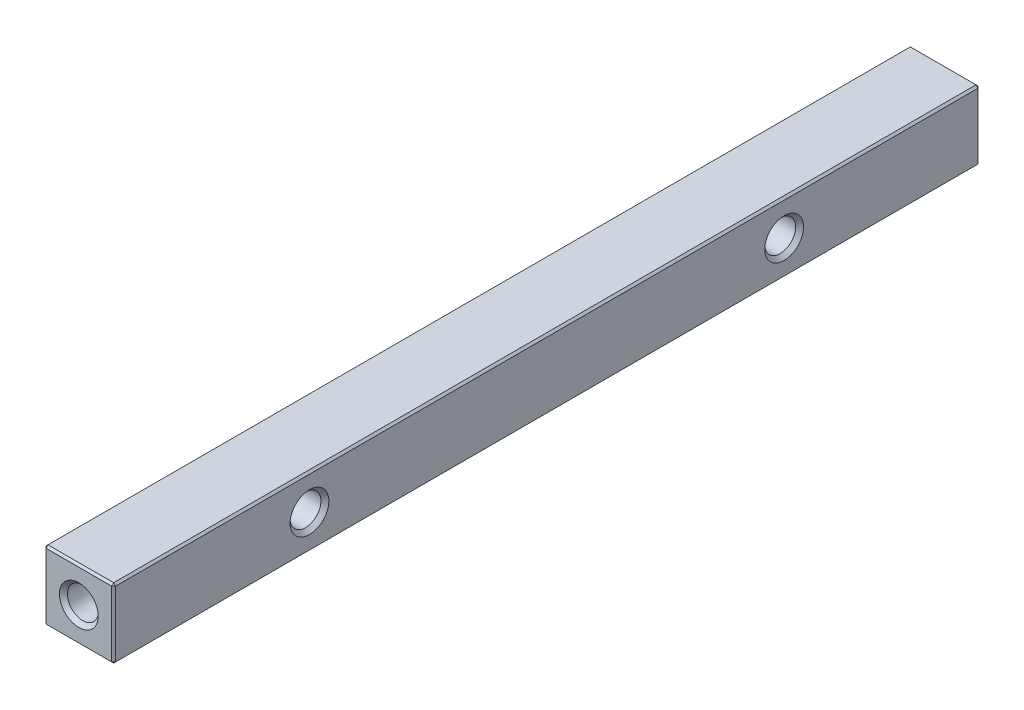
ISO-10303-21;
HEADER;
FILE_DESCRIPTION(('STEP AP214'),'2;1');
FILE_NAME('part.step','',(''),(''),'','','');
FILE_SCHEMA(('AUTOMOTIVE_DESIGN { 1 0 10303 214 1 1 1 1 }'));
ENDSEC;
DATA;
#1=APPLICATION_CONTEXT('core data for automotive mechanical design processes');
#2=APPLICATION_PROTOCOL_DEFINITION('international standard','automotive_design',2000,#1);
#3=PRODUCT_CONTEXT('',#1,'mechanical');
#4=PRODUCT('Part','Part','',(#3));
#5=PRODUCT_RELATED_PRODUCT_CATEGORY('part','',(#4));
#6=PRODUCT_DEFINITION_FORMATION('','',#4);
#7=PRODUCT_DEFINITION_CONTEXT('part definition',#1,'design');
#8=PRODUCT_DEFINITION('design','',#6,#7);
#9=PRODUCT_DEFINITION_SHAPE('','',#8);
#10=(LENGTH_UNIT() NAMED_UNIT(*) SI_UNIT(.MILLI.,.METRE.));
#11=(NAMED_UNIT(*) PLANE_ANGLE_UNIT() SI_UNIT($,.RADIAN.));
#12=(NAMED_UNIT(*) SI_UNIT($,.STERADIAN.) SOLID_ANGLE_UNIT());
#13=UNCERTAINTY_MEASURE_WITH_UNIT(LENGTH_MEASURE(1.E-05),#10,'distance_accuracy_value','');
#14=(GEOMETRIC_REPRESENTATION_CONTEXT(3) GLOBAL_UNCERTAINTY_ASSIGNED_CONTEXT((#13)) GLOBAL_UNIT_ASSIGNED_CONTEXT((#10,
#11,#12)) REPRESENTATION_CONTEXT('',''));
#15=CARTESIAN_POINT('',(0.,0.,0.));
#16=DIRECTION('',(0.,0.,1.));
#17=DIRECTION('',(1.,0.,0.));
#18=AXIS2_PLACEMENT_3D('',#15,#16,#17);
#19=CARTESIAN_POINT('',(4.4,4.39999999999998,54.75));
#20=DIRECTION('',(-1.,0.,0.));
#21=DIRECTION('',(0.,0.,1.));
#22=AXIS2_PLACEMENT_3D('',#19,#20,#21);
#23=PLANE('',#22);
#24=DIRECTION('',(0.,0.,-1.));
#25=VECTOR('',#24,1.);
#26=CARTESIAN_POINT('',(4.4,-4.14999999999998,54.75));
#27=LINE('',#26,#25);
#28=CARTESIAN_POINT('',(4.4,-4.14999999999998,54.5));
#29=VERTEX_POINT('',#28);
#30=CARTESIAN_POINT('',(4.4,-4.14999999999998,-54.5));
#31=VERTEX_POINT('',#30);
#32=EDGE_CURVE('E191',#29,#31,#27,.T.);
#33=ORIENTED_EDGE('',*,*,#32,.T.);
#34=DIRECTION('',(0.,1.,0.));
#35=VECTOR('',#34,1.);
#36=CARTESIAN_POINT('',(4.4,4.39999999999998,-54.5));
#37=LINE('',#36,#35);
#38=CARTESIAN_POINT('',(4.4,4.14999999999998,-54.5));
#39=VERTEX_POINT('',#38);
#40=EDGE_CURVE('E192',#31,#39,#37,.T.);
#41=ORIENTED_EDGE('',*,*,#40,.T.);
#42=DIRECTION('',(0.,0.,1.));
#43=VECTOR('',#42,1.);
#44=CARTESIAN_POINT('',(4.4,4.14999999999998,54.75));
#45=LINE('',#44,#43);
#46=CARTESIAN_POINT('',(4.4,4.14999999999998,54.5));
#47=VERTEX_POINT('',#46);
#48=EDGE_CURVE('E188',#39,#47,#45,.T.);
#49=ORIENTED_EDGE('',*,*,#48,.T.);
#50=DIRECTION('',(0.,-1.,0.));
#51=VECTOR('',#50,1.);
#52=CARTESIAN_POINT('',(4.4,-4.39999999999998,54.5));
#53=LINE('',#52,#51);
#54=EDGE_CURVE('E187',#47,#29,#53,.T.);
#55=ORIENTED_EDGE('',*,*,#54,.T.);
#56=EDGE_LOOP('',(#33,#41,#49,#55));
#57=FACE_BOUND('',#56,.T.);
#58=CARTESIAN_POINT('',(4.4,0.,-30.));
#59=DIRECTION('',(-1.,0.,0.));
#60=DIRECTION('',(0.,0.,1.));
#61=AXIS2_PLACEMENT_3D('',#58,#59,#60);
#62=CIRCLE('',#61,2.45000000000005);
#63=CARTESIAN_POINT('',(4.4,0.,-27.55));
#64=VERTEX_POINT('',#63);
#65=EDGE_CURVE('E291',#64,#64,#62,.T.);
#66=ORIENTED_EDGE('',*,*,#65,.T.);
#67=EDGE_LOOP('',(#66));
#68=FACE_BOUND('',#67,.T.);
#69=CARTESIAN_POINT('',(4.4,0.,30.));
#70=DIRECTION('',(-1.,0.,0.));
#71=DIRECTION('',(0.,0.,1.));
#72=AXIS2_PLACEMENT_3D('',#69,#70,#71);
#73=CIRCLE('',#72,2.45000000000005);
#74=CARTESIAN_POINT('',(4.4,0.,32.45));
#75=VERTEX_POINT('',#74);
#76=EDGE_CURVE('E289',#75,#75,#73,.T.);
#77=ORIENTED_EDGE('',*,*,#76,.T.);
#78=EDGE_LOOP('',(#77));
#79=FACE_BOUND('',#78,.T.);
#80=ADVANCED_FACE('F41',(#57,#68,#79),#23,.F.);
#81=CARTESIAN_POINT('',(-4.4,4.39999999999998,54.75));
#82=DIRECTION('',(0.,-1.,0.));
#83=DIRECTION('',(0.,0.,-1.));
#84=AXIS2_PLACEMENT_3D('',#81,#82,#83);
#85=PLANE('',#84);
#86=DIRECTION('',(1.,0.,0.));
#87=VECTOR('',#86,1.);
#88=CARTESIAN_POINT('',(4.4,4.39999999999998,54.5));
#89=LINE('',#88,#87);
#90=CARTESIAN_POINT('',(-4.15,4.39999999999998,54.5));
#91=VERTEX_POINT('',#90);
#92=CARTESIAN_POINT('',(4.15,4.39999999999998,54.5));
#93=VERTEX_POINT('',#92);
#94=EDGE_CURVE('E202',#91,#93,#89,.T.);
#95=ORIENTED_EDGE('',*,*,#94,.T.);
#96=DIRECTION('',(0.,0.,-1.));
#97=VECTOR('',#96,1.);
#98=CARTESIAN_POINT('',(4.15,4.39999999999998,54.75));
#99=LINE('',#98,#97);
#100=CARTESIAN_POINT('',(4.15,4.39999999999998,-54.5));
#101=VERTEX_POINT('',#100);
#102=EDGE_CURVE('E11',#93,#101,#99,.T.);
#103=ORIENTED_EDGE('',*,*,#102,.T.);
#104=DIRECTION('',(-1.,0.,0.));
#105=VECTOR('',#104,1.);
#106=CARTESIAN_POINT('',(-4.4,4.39999999999998,-54.5));
#107=LINE('',#106,#105);
#108=CARTESIAN_POINT('',(-4.15,4.39999999999998,-54.5));
#109=VERTEX_POINT('',#108);
#110=EDGE_CURVE('E51',#101,#109,#107,.T.);
#111=ORIENTED_EDGE('',*,*,#110,.T.);
#112=DIRECTION('',(0.,0.,1.));
#113=VECTOR('',#112,1.);
#114=CARTESIAN_POINT('',(-4.15,4.39999999999998,54.75));
#115=LINE('',#114,#113);
#116=EDGE_CURVE('E210',#109,#91,#115,.T.);
#117=ORIENTED_EDGE('',*,*,#116,.T.);
#118=EDGE_LOOP('',(#95,#103,#111,#117));
#119=FACE_BOUND('',#118,.T.);
#120=ADVANCED_FACE('F370',(#119),#85,.F.);
#121=CARTESIAN_POINT('',(-4.4,4.39999999999998,54.75));
#122=DIRECTION('',(1.,0.,0.));
#123=DIRECTION('',(0.,0.,-1.));
#124=AXIS2_PLACEMENT_3D('',#121,#122,#123);
#125=PLANE('',#124);
#126=DIRECTION('',(0.,-1.,0.));
#127=VECTOR('',#126,1.);
#128=CARTESIAN_POINT('',(-4.4,4.39999999999998,-54.5));
#129=LINE('',#128,#127);
#130=CARTESIAN_POINT('',(-4.4,4.14999999999998,-54.5));
#131=VERTEX_POINT('',#130);
#132=CARTESIAN_POINT('',(-4.4,-4.14999999999998,-54.5));
#133=VERTEX_POINT('',#132);
#134=EDGE_CURVE('E175',#131,#133,#129,.T.);
#135=ORIENTED_EDGE('',*,*,#134,.T.);
#136=DIRECTION('',(0.,0.,1.));
#137=VECTOR('',#136,1.);
#138=CARTESIAN_POINT('',(-4.4,-4.14999999999998,54.75));
#139=LINE('',#138,#137);
#140=CARTESIAN_POINT('',(-4.4,-4.14999999999998,54.5));
#141=VERTEX_POINT('',#140);
#142=EDGE_CURVE('E138',#133,#141,#139,.T.);
#143=ORIENTED_EDGE('',*,*,#142,.T.);
#144=DIRECTION('',(0.,1.,0.));
#145=VECTOR('',#144,1.);
#146=CARTESIAN_POINT('',(-4.4,4.39999999999998,54.5));
#147=LINE('',#146,#145);
#148=CARTESIAN_POINT('',(-4.4,4.14999999999998,54.5));
#149=VERTEX_POINT('',#148);
#150=EDGE_CURVE('E170',#141,#149,#147,.T.);
#151=ORIENTED_EDGE('',*,*,#150,.T.);
#152=DIRECTION('',(0.,0.,-1.));
#153=VECTOR('',#152,1.);
#154=CARTESIAN_POINT('',(-4.4,4.14999999999998,54.75));
#155=LINE('',#154,#153);
#156=EDGE_CURVE('E166',#149,#131,#155,.T.);
#157=ORIENTED_EDGE('',*,*,#156,.T.);
#158=EDGE_LOOP('',(#135,#143,#151,#157));
#159=FACE_BOUND('',#158,.T.);
#160=CARTESIAN_POINT('',(-4.4,0.,-30.));
#161=DIRECTION('',(1.,0.,0.));
#162=DIRECTION('',(0.,0.,-1.));
#163=AXIS2_PLACEMENT_3D('',#160,#161,#162);
#164=CIRCLE('',#163,2.45000000000005);
#165=CARTESIAN_POINT('',(-4.4,0.,-32.45));
#166=VERTEX_POINT('',#165);
#167=EDGE_CURVE('E290',#166,#166,#164,.T.);
#168=ORIENTED_EDGE('',*,*,#167,.T.);
#169=EDGE_LOOP('',(#168));
#170=FACE_BOUND('',#169,.T.);
#171=CARTESIAN_POINT('',(-4.4,0.,30.));
#172=DIRECTION('',(1.,0.,0.));
#173=DIRECTION('',(0.,0.,-1.));
#174=AXIS2_PLACEMENT_3D('',#171,#172,#173);
#175=CIRCLE('',#174,2.45000000000005);
#176=CARTESIAN_POINT('',(-4.4,0.,27.55));
#177=VERTEX_POINT('',#176);
#178=EDGE_CURVE('E283',#177,#177,#175,.T.);
#179=ORIENTED_EDGE('',*,*,#178,.T.);
#180=EDGE_LOOP('',(#179));
#181=FACE_BOUND('',#180,.T.);
#182=ADVANCED_FACE('F336',(#159,#170,#181),#125,.F.);
#183=CARTESIAN_POINT('',(-4.4,-4.39999999999998,54.75));
#184=DIRECTION('',(0.,1.,0.));
#185=DIRECTION('',(0.,0.,1.));
#186=AXIS2_PLACEMENT_3D('',#183,#184,#185);
#187=PLANE('',#186);
#188=DIRECTION('',(-1.,0.,0.));
#189=VECTOR('',#188,1.);
#190=CARTESIAN_POINT('',(-4.4,-4.39999999999998,54.5));
#191=LINE('',#190,#189);
#192=CARTESIAN_POINT('',(4.15,-4.39999999999998,54.5));
#193=VERTEX_POINT('',#192);
#194=CARTESIAN_POINT('',(-4.15,-4.39999999999998,54.5));
#195=VERTEX_POINT('',#194);
#196=EDGE_CURVE('E164',#193,#195,#191,.T.);
#197=ORIENTED_EDGE('',*,*,#196,.T.);
#198=DIRECTION('',(0.,0.,-1.));
#199=VECTOR('',#198,1.);
#200=CARTESIAN_POINT('',(-4.15,-4.39999999999998,54.75));
#201=LINE('',#200,#199);
#202=CARTESIAN_POINT('',(-4.15,-4.39999999999998,-54.5));
#203=VERTEX_POINT('',#202);
#204=EDGE_CURVE('E136',#195,#203,#201,.T.);
#205=ORIENTED_EDGE('',*,*,#204,.T.);
#206=DIRECTION('',(1.,0.,0.));
#207=VECTOR('',#206,1.);
#208=CARTESIAN_POINT('',(-4.4,-4.39999999999998,-54.5));
#209=LINE('',#208,#207);
#210=CARTESIAN_POINT('',(4.15,-4.39999999999998,-54.5));
#211=VERTEX_POINT('',#210);
#212=EDGE_CURVE('E152',#203,#211,#209,.T.);
#213=ORIENTED_EDGE('',*,*,#212,.T.);
#214=DIRECTION('',(0.,0.,1.));
#215=VECTOR('',#214,1.);
#216=CARTESIAN_POINT('',(4.15,-4.39999999999998,54.75));
#217=LINE('',#216,#215);
#218=EDGE_CURVE('E159',#211,#193,#217,.T.);
#219=ORIENTED_EDGE('',*,*,#218,.T.);
#220=EDGE_LOOP('',(#197,#205,#213,#219));
#221=FACE_BOUND('',#220,.T.);
#222=ADVANCED_FACE('F162',(#221),#187,.F.);
#223=CARTESIAN_POINT('',(0.,0.,54.75));
#224=DIRECTION('',(0.,0.,1.));
#225=DIRECTION('',(1.,0.,0.));
#226=AXIS2_PLACEMENT_3D('',#223,#224,#225);
#227=PLANE('',#226);
#228=DIRECTION('',(0.,-1.,0.));
#229=VECTOR('',#228,1.);
#230=CARTESIAN_POINT('',(-4.15,-4.39999999999998,54.75));
#231=LINE('',#230,#229);
#232=CARTESIAN_POINT('',(-4.15,4.14999999999998,54.75));
#233=VERTEX_POINT('',#232);
#234=CARTESIAN_POINT('',(-4.15,-4.14999999999998,54.75));
#235=VERTEX_POINT('',#234);
#236=EDGE_CURVE('E185',#233,#235,#231,.T.);
#237=ORIENTED_EDGE('',*,*,#236,.T.);
#238=DIRECTION('',(1.,0.,0.));
#239=VECTOR('',#238,1.);
#240=CARTESIAN_POINT('',(4.4,-4.14999999999998,54.75));
#241=LINE('',#240,#239);
#242=CARTESIAN_POINT('',(4.15,-4.14999999999998,54.75));
#243=VERTEX_POINT('',#242);
#244=EDGE_CURVE('E184',#235,#243,#241,.T.);
#245=ORIENTED_EDGE('',*,*,#244,.T.);
#246=DIRECTION('',(0.,1.,0.));
#247=VECTOR('',#246,1.);
#248=CARTESIAN_POINT('',(4.15,4.39999999999998,54.75));
#249=LINE('',#248,#247);
#250=CARTESIAN_POINT('',(4.15,4.14999999999998,54.75));
#251=VERTEX_POINT('',#250);
#252=EDGE_CURVE('E178',#243,#251,#249,.T.);
#253=ORIENTED_EDGE('',*,*,#252,.T.);
#254=DIRECTION('',(-1.,0.,0.));
#255=VECTOR('',#254,1.);
#256=CARTESIAN_POINT('',(-4.4,4.14999999999998,54.75));
#257=LINE('',#256,#255);
#258=EDGE_CURVE('E179',#251,#233,#257,.T.);
#259=ORIENTED_EDGE('',*,*,#258,.T.);
#260=EDGE_LOOP('',(#237,#245,#253,#259));
#261=FACE_BOUND('',#260,.T.);
#262=CARTESIAN_POINT('',(0.,0.,54.75));
#263=DIRECTION('',(0.,0.,1.));
#264=DIRECTION('',(1.,0.,0.));
#265=AXIS2_PLACEMENT_3D('',#262,#263,#264);
#266=CIRCLE('',#265,2.44999999999999);
#267=CARTESIAN_POINT('',(2.44999999999999,0.,54.75));
#268=VERTEX_POINT('',#267);
#269=EDGE_CURVE('E161',#268,#268,#266,.F.);
#270=ORIENTED_EDGE('',*,*,#269,.T.);
#271=EDGE_LOOP('',(#270));
#272=FACE_BOUND('',#271,.T.);
#273=ADVANCED_FACE('F523',(#261,#272),#227,.T.);
#274=CARTESIAN_POINT('',(0.,0.,-54.75));
#275=DIRECTION('',(0.,0.,1.));
#276=DIRECTION('',(1.,0.,0.));
#277=AXIS2_PLACEMENT_3D('',#274,#275,#276);
#278=PLANE('',#277);
#279=DIRECTION('',(0.,-1.,0.));
#280=VECTOR('',#279,1.);
#281=CARTESIAN_POINT('',(4.15,0.,-54.75));
#282=LINE('',#281,#280);
#283=CARTESIAN_POINT('',(4.15,4.14999999999998,-54.75));
#284=VERTEX_POINT('',#283);
#285=CARTESIAN_POINT('',(4.15,-4.14999999999998,-54.75));
#286=VERTEX_POINT('',#285);
#287=EDGE_CURVE('E199',#284,#286,#282,.T.);
#288=ORIENTED_EDGE('',*,*,#287,.T.);
#289=DIRECTION('',(-1.,0.,0.));
#290=VECTOR('',#289,1.);
#291=CARTESIAN_POINT('',(0.,-4.14999999999998,-54.75));
#292=LINE('',#291,#290);
#293=CARTESIAN_POINT('',(-4.15,-4.14999999999998,-54.75));
#294=VERTEX_POINT('',#293);
#295=EDGE_CURVE('E205',#286,#294,#292,.T.);
#296=ORIENTED_EDGE('',*,*,#295,.T.);
#297=DIRECTION('',(0.,1.,0.));
#298=VECTOR('',#297,1.);
#299=CARTESIAN_POINT('',(-4.15,0.,-54.75));
#300=LINE('',#299,#298);
#301=CARTESIAN_POINT('',(-4.15,4.14999999999998,-54.75));
#302=VERTEX_POINT('',#301);
#303=EDGE_CURVE('E198',#294,#302,#300,.T.);
#304=ORIENTED_EDGE('',*,*,#303,.T.);
#305=DIRECTION('',(1.,0.,0.));
#306=VECTOR('',#305,1.);
#307=CARTESIAN_POINT('',(0.,4.14999999999998,-54.75));
#308=LINE('',#307,#306);
#309=EDGE_CURVE('E196',#302,#284,#308,.T.);
#310=ORIENTED_EDGE('',*,*,#309,.T.);
#311=EDGE_LOOP('',(#288,#296,#304,#310));
#312=FACE_BOUND('',#311,.T.);
#313=CARTESIAN_POINT('',(0.,0.,-54.75));
#314=DIRECTION('',(0.,0.,1.));
#315=DIRECTION('',(1.,0.,0.));
#316=AXIS2_PLACEMENT_3D('',#313,#314,#315);
#317=CIRCLE('',#316,2.44999999999999);
#318=CARTESIAN_POINT('',(2.44999999999999,0.,-54.75));
#319=VERTEX_POINT('',#318);
#320=EDGE_CURVE('E305',#319,#319,#317,.T.);
#321=ORIENTED_EDGE('',*,*,#320,.T.);
#322=EDGE_LOOP('',(#321));
#323=FACE_BOUND('',#322,.T.);
#324=ADVANCED_FACE('F344',(#312,#323),#278,.F.);
#325=CARTESIAN_POINT('',(0.,0.,46.75));
#326=DIRECTION('',(0.,0.,1.));
#327=DIRECTION('',(1.,0.,0.));
#328=AXIS2_PLACEMENT_3D('',#325,#326,#327);
#329=CYLINDRICAL_SURFACE('',#328,1.95);
#330=CARTESIAN_POINT('',(0.,0.,54.25));
#331=DIRECTION('',(0.,0.,1.));
#332=DIRECTION('',(1.,0.,0.));
#333=AXIS2_PLACEMENT_3D('',#330,#331,#332);
#334=CIRCLE('',#333,1.95);
#335=CARTESIAN_POINT('',(1.95,0.,54.25));
#336=VERTEX_POINT('',#335);
#337=EDGE_CURVE('E306',#336,#336,#334,.T.);
#338=ORIENTED_EDGE('',*,*,#337,.T.);
#339=EDGE_LOOP('',(#338));
#340=FACE_BOUND('',#339,.T.);
#341=CARTESIAN_POINT('',(0.,0.,46.75));
#342=DIRECTION('',(0.,0.,1.));
#343=DIRECTION('',(1.,0.,0.));
#344=AXIS2_PLACEMENT_3D('',#341,#342,#343);
#345=CIRCLE('',#344,1.95);
#346=CARTESIAN_POINT('',(1.95,0.,46.75));
#347=VERTEX_POINT('',#346);
#348=EDGE_CURVE('E271',#347,#347,#345,.T.);
#349=ORIENTED_EDGE('',*,*,#348,.F.);
#350=EDGE_LOOP('',(#349));
#351=FACE_BOUND('',#350,.T.);
#352=ADVANCED_FACE('F533',(#340,#351),#329,.F.);
#353=CARTESIAN_POINT('',(0.,0.,46.75));
#354=DIRECTION('',(0.,0.,1.));
#355=DIRECTION('',(1.,0.,0.));
#356=AXIS2_PLACEMENT_3D('',#353,#354,#355);
#357=PLANE('',#356);
#358=ORIENTED_EDGE('',*,*,#348,.T.);
#359=EDGE_LOOP('',(#358));
#360=FACE_BOUND('',#359,.T.);
#361=ADVANCED_FACE('F534',(#360),#357,.T.);
#362=CARTESIAN_POINT('',(0.,0.,-46.75));
#363=DIRECTION('',(0.,0.,-1.));
#364=DIRECTION('',(-1.,0.,0.));
#365=AXIS2_PLACEMENT_3D('',#362,#363,#364);
#366=CYLINDRICAL_SURFACE('',#365,1.95);
#367=CARTESIAN_POINT('',(0.,0.,-54.25));
#368=DIRECTION('',(0.,0.,1.));
#369=DIRECTION('',(1.,0.,0.));
#370=AXIS2_PLACEMENT_3D('',#367,#368,#369);
#371=CIRCLE('',#370,1.95);
#372=CARTESIAN_POINT('',(1.95,0.,-54.25));
#373=VERTEX_POINT('',#372);
#374=EDGE_CURVE('E304',#373,#373,#371,.F.);
#375=ORIENTED_EDGE('',*,*,#374,.T.);
#376=EDGE_LOOP('',(#375));
#377=FACE_BOUND('',#376,.T.);
#378=CARTESIAN_POINT('',(0.,0.,-46.75));
#379=DIRECTION('',(0.,0.,1.));
#380=DIRECTION('',(1.,0.,0.));
#381=AXIS2_PLACEMENT_3D('',#378,#379,#380);
#382=CIRCLE('',#381,1.95);
#383=CARTESIAN_POINT('',(1.95,0.,-46.75));
#384=VERTEX_POINT('',#383);
#385=EDGE_CURVE('E264',#384,#384,#382,.T.);
#386=ORIENTED_EDGE('',*,*,#385,.T.);
#387=EDGE_LOOP('',(#386));
#388=FACE_BOUND('',#387,.T.);
#389=ADVANCED_FACE('F537',(#377,#388),#366,.F.);
#390=CARTESIAN_POINT('',(0.,0.,-46.75));
#391=DIRECTION('',(0.,0.,-1.));
#392=DIRECTION('',(1.,0.,0.));
#393=AXIS2_PLACEMENT_3D('',#390,#391,#392);
#394=PLANE('',#393);
#395=ORIENTED_EDGE('',*,*,#385,.F.);
#396=EDGE_LOOP('',(#395));
#397=FACE_BOUND('',#396,.T.);
#398=ADVANCED_FACE('F544',(#397),#394,.T.);
#399=CARTESIAN_POINT('',(-4.401,0.,-30.));
#400=DIRECTION('',(1.,0.,0.));
#401=DIRECTION('',(0.,0.,-1.));
#402=AXIS2_PLACEMENT_3D('',#399,#400,#401);
#403=CYLINDRICAL_SURFACE('',#402,1.95);
#404=CARTESIAN_POINT('',(-3.89999999999996,0.,-30.));
#405=DIRECTION('',(1.,0.,0.));
#406=DIRECTION('',(0.,0.,-1.));
#407=AXIS2_PLACEMENT_3D('',#404,#405,#406);
#408=CIRCLE('',#407,1.95);
#409=CARTESIAN_POINT('',(-3.89999999999996,0.,-31.95));
#410=VERTEX_POINT('',#409);
#411=EDGE_CURVE('E281',#410,#410,#408,.F.);
#412=CARTESIAN_POINT('',(3.89999999999996,0.,-30.));
#413=DIRECTION('',(-1.,0.,0.));
#414=DIRECTION('',(0.,0.,1.));
#415=AXIS2_PLACEMENT_3D('',#412,#413,#414);
#416=CIRCLE('',#415,1.95);
#417=CARTESIAN_POINT('',(3.89999999999996,0.,-31.95));
#418=VERTEX_POINT('',#417);
#419=EDGE_CURVE('E277',#418,#418,#416,.F.);
#420=CARTESIAN_POINT('',(-3.89999999999996,0.,-31.95));
#421=CARTESIAN_POINT('',(-3.81874999999996,0.,-31.95));
#422=CARTESIAN_POINT('',(-3.73749999999996,0.,-31.95));
#423=CARTESIAN_POINT('',(-3.57499999999996,0.,-31.95));
#424=CARTESIAN_POINT('',(-3.49374999999996,0.,-31.95));
#425=CARTESIAN_POINT('',(-3.33124999999996,0.,-31.95));
#426=CARTESIAN_POINT('',(-3.24999999999996,0.,-31.95));
#427=CARTESIAN_POINT('',(-3.08749999999997,0.,-31.95));
#428=CARTESIAN_POINT('',(-3.00624999999997,0.,-31.95));
#429=CARTESIAN_POINT('',(-2.84374999999997,0.,-31.95));
#430=CARTESIAN_POINT('',(-2.76249999999997,0.,-31.95));
#431=CARTESIAN_POINT('',(-2.59999999999997,0.,-31.95));
#432=CARTESIAN_POINT('',(-2.51874999999997,0.,-31.95));
#433=CARTESIAN_POINT('',(-2.35624999999997,0.,-31.95));
#434=CARTESIAN_POINT('',(-2.27499999999998,0.,-31.95));
#435=CARTESIAN_POINT('',(-2.11249999999998,0.,-31.95));
#436=CARTESIAN_POINT('',(-2.03124999999998,0.,-31.95));
#437=CARTESIAN_POINT('',(-1.86874999999998,0.,-31.95));
#438=CARTESIAN_POINT('',(-1.78749999999998,0.,-31.95));
#439=CARTESIAN_POINT('',(-1.62499999999998,0.,-31.95));
#440=CARTESIAN_POINT('',(-1.54374999999998,0.,-31.95));
#441=CARTESIAN_POINT('',(-1.38124999999998,0.,-31.95));
#442=CARTESIAN_POINT('',(-1.29999999999998,0.,-31.95));
#443=CARTESIAN_POINT('',(-1.13749999999999,0.,-31.95));
#444=CARTESIAN_POINT('',(-1.05624999999999,0.,-31.95));
#445=CARTESIAN_POINT('',(-0.893749999999989,0.,-31.95));
#446=CARTESIAN_POINT('',(-0.81249999999999,0.,-31.95));
#447=CARTESIAN_POINT('',(-0.649999999999992,0.,-31.95));
#448=CARTESIAN_POINT('',(-0.568749999999993,0.,-31.95));
#449=CARTESIAN_POINT('',(-0.406249999999995,0.,-31.95));
#450=CARTESIAN_POINT('',(-0.324999999999996,0.,-31.95));
#451=CARTESIAN_POINT('',(-0.162499999999997,0.,-31.95));
#452=CARTESIAN_POINT('',(-0.0812499999999983,0.,-31.95));
#453=CARTESIAN_POINT('',(0.0812500000000003,0.,-31.95));
#454=CARTESIAN_POINT('',(0.1625,0.,-31.95));
#455=CARTESIAN_POINT('',(0.324999999999998,0.,-31.95));
#456=CARTESIAN_POINT('',(0.406249999999998,0.,-31.95));
#457=CARTESIAN_POINT('',(0.568749999999996,0.,-31.95));
#458=CARTESIAN_POINT('',(0.649999999999995,0.,-31.95));
#459=CARTESIAN_POINT('',(0.812499999999993,0.,-31.95));
#460=CARTESIAN_POINT('',(0.893749999999992,0.,-31.95));
#461=CARTESIAN_POINT('',(1.05624999999999,0.,-31.95));
#462=CARTESIAN_POINT('',(1.13749999999999,0.,-31.95));
#463=CARTESIAN_POINT('',(1.29999999999999,0.,-31.95));
#464=CARTESIAN_POINT('',(1.38124999999999,0.,-31.95));
#465=CARTESIAN_POINT('',(1.54374999999999,0.,-31.95));
#466=CARTESIAN_POINT('',(1.62499999999998,0.,-31.95));
#467=CARTESIAN_POINT('',(1.78749999999998,0.,-31.95));
#468=CARTESIAN_POINT('',(1.86874999999998,0.,-31.95));
#469=CARTESIAN_POINT('',(2.03124999999998,0.,-31.95));
#470=CARTESIAN_POINT('',(2.11249999999998,0.,-31.95));
#471=CARTESIAN_POINT('',(2.27499999999998,0.,-31.95));
#472=CARTESIAN_POINT('',(2.35624999999998,0.,-31.95));
#473=CARTESIAN_POINT('',(2.51874999999998,0.,-31.95));
#474=CARTESIAN_POINT('',(2.59999999999997,0.,-31.95));
#475=CARTESIAN_POINT('',(2.76249999999997,0.,-31.95));
#476=CARTESIAN_POINT('',(2.84374999999997,0.,-31.95));
#477=CARTESIAN_POINT('',(3.00624999999997,0.,-31.95));
#478=CARTESIAN_POINT('',(3.08749999999997,0.,-31.95));
#479=CARTESIAN_POINT('',(3.24999999999997,0.,-31.95));
#480=CARTESIAN_POINT('',(3.33124999999997,0.,-31.95));
#481=CARTESIAN_POINT('',(3.49374999999996,0.,-31.95));
#482=CARTESIAN_POINT('',(3.57499999999996,0.,-31.95));
#483=CARTESIAN_POINT('',(3.73749999999996,0.,-31.95));
#484=CARTESIAN_POINT('',(3.81874999999996,0.,-31.95));
#485=CARTESIAN_POINT('',(3.89999999999996,0.,-31.95));
#486=B_SPLINE_CURVE_WITH_KNOTS('',3,(#420,#421,#422,#423,#424,#425,#426,#427,#428,#429,#430,
#431,#432,#433,#434,#435,#436,#437,#438,#439,#440,#441,#442,#443,#444,#445,#446,#447,#448,#449,
#450,#451,#452,#453,#454,#455,#456,#457,#458,#459,#460,#461,#462,#463,#464,#465,#466,#467,#468,
#469,#470,#471,#472,#473,#474,#475,#476,#477,#478,#479,#480,#481,#482,#483,#484,#485),
.UNSPECIFIED.,.F.,.F.,(4,2,2,2,2,2,2,2,2,2,2,2,2,2,2,2,2,2,2,2,2,2,2,2,2,2,2,2,2,2,2,2,4),(0.,
0.243749999999997,0.487499999999995,0.731249999999993,0.97499999999999,1.21874999999999,
1.46249999999998,1.70624999999998,1.94999999999998,2.19374999999998,2.43749999999997,
2.68124999999997,2.92499999999997,3.16874999999997,3.41249999999996,3.65624999999996,
3.89999999999996,4.14374999999996,4.38749999999995,4.63124999999995,4.87499999999995,
5.11874999999995,5.36249999999994,5.60624999999994,5.84999999999994,6.09374999999994,
6.33749999999993,6.58124999999993,6.82499999999993,7.06874999999993,7.31249999999992,
7.55624999999992,7.79999999999992),.UNSPECIFIED.);
#487=EDGE_CURVE('BSEAM745',#410,#418,#486,.T.);
#488=ORIENTED_EDGE('',*,*,#411,.T.);
#489=ORIENTED_EDGE('',*,*,#419,.T.);
#490=ORIENTED_EDGE('',*,*,#487,.T.);
#491=ORIENTED_EDGE('',*,*,#487,.F.);
#492=EDGE_LOOP('',(#488,#490,#489,#491));
#493=FACE_BOUND('',#492,.T.);
#494=ADVANCED_FACE('F745',(#493),#403,.F.);
#495=CARTESIAN_POINT('',(-4.401,0.,30.));
#496=DIRECTION('',(1.,0.,0.));
#497=DIRECTION('',(0.,0.,-1.));
#498=AXIS2_PLACEMENT_3D('',#495,#496,#497);
#499=CYLINDRICAL_SURFACE('',#498,1.95);
#500=CARTESIAN_POINT('',(3.89999999999996,0.,30.));
#501=DIRECTION('',(-1.,0.,0.));
#502=DIRECTION('',(0.,0.,1.));
#503=AXIS2_PLACEMENT_3D('',#500,#501,#502);
#504=CIRCLE('',#503,1.95);
#505=CARTESIAN_POINT('',(3.89999999999996,0.,28.05));
#506=VERTEX_POINT('',#505);
#507=EDGE_CURVE('E298',#506,#506,#504,.F.);
#508=CARTESIAN_POINT('',(-3.89999999999996,0.,30.));
#509=DIRECTION('',(1.,0.,0.));
#510=DIRECTION('',(0.,0.,-1.));
#511=AXIS2_PLACEMENT_3D('',#508,#509,#510);
#512=CIRCLE('',#511,1.95);
#513=CARTESIAN_POINT('',(-3.89999999999996,0.,28.05));
#514=VERTEX_POINT('',#513);
#515=EDGE_CURVE('E296',#514,#514,#512,.F.);
#516=CARTESIAN_POINT('',(3.89999999999996,0.,28.05));
#517=CARTESIAN_POINT('',(3.81874999999996,0.,28.05));
#518=CARTESIAN_POINT('',(3.73749999999996,0.,28.05));
#519=CARTESIAN_POINT('',(3.57499999999996,0.,28.05));
#520=CARTESIAN_POINT('',(3.49374999999996,0.,28.05));
#521=CARTESIAN_POINT('',(3.33124999999997,0.,28.05));
#522=CARTESIAN_POINT('',(3.24999999999997,0.,28.05));
#523=CARTESIAN_POINT('',(3.08749999999997,0.,28.05));
#524=CARTESIAN_POINT('',(3.00624999999997,0.,28.05));
#525=CARTESIAN_POINT('',(2.84374999999997,0.,28.05));
#526=CARTESIAN_POINT('',(2.76249999999997,0.,28.05));
#527=CARTESIAN_POINT('',(2.59999999999997,0.,28.05));
#528=CARTESIAN_POINT('',(2.51874999999998,0.,28.05));
#529=CARTESIAN_POINT('',(2.35624999999998,0.,28.05));
#530=CARTESIAN_POINT('',(2.27499999999998,0.,28.05));
#531=CARTESIAN_POINT('',(2.11249999999998,0.,28.05));
#532=CARTESIAN_POINT('',(2.03124999999998,0.,28.05));
#533=CARTESIAN_POINT('',(1.86874999999998,0.,28.05));
#534=CARTESIAN_POINT('',(1.78749999999998,0.,28.05));
#535=CARTESIAN_POINT('',(1.62499999999998,0.,28.05));
#536=CARTESIAN_POINT('',(1.54374999999999,0.,28.05));
#537=CARTESIAN_POINT('',(1.38124999999999,0.,28.05));
#538=CARTESIAN_POINT('',(1.29999999999999,0.,28.05));
#539=CARTESIAN_POINT('',(1.13749999999999,0.,28.05));
#540=CARTESIAN_POINT('',(1.05624999999999,0.,28.05));
#541=CARTESIAN_POINT('',(0.893749999999992,0.,28.05));
#542=CARTESIAN_POINT('',(0.812499999999993,0.,28.05));
#543=CARTESIAN_POINT('',(0.649999999999995,0.,28.05));
#544=CARTESIAN_POINT('',(0.568749999999996,0.,28.05));
#545=CARTESIAN_POINT('',(0.406249999999998,0.,28.05));
#546=CARTESIAN_POINT('',(0.324999999999998,0.,28.05));
#547=CARTESIAN_POINT('',(0.1625,0.,28.05));
#548=CARTESIAN_POINT('',(0.0812500000000009,0.,28.05));
#549=CARTESIAN_POINT('',(-0.0812499999999977,0.,28.05));
#550=CARTESIAN_POINT('',(-0.162499999999997,0.,28.05));
#551=CARTESIAN_POINT('',(-0.324999999999996,0.,28.05));
#552=CARTESIAN_POINT('',(-0.406249999999995,0.,28.05));
#553=CARTESIAN_POINT('',(-0.568749999999993,0.,28.05));
#554=CARTESIAN_POINT('',(-0.649999999999992,0.,28.05));
#555=CARTESIAN_POINT('',(-0.81249999999999,0.,28.05));
#556=CARTESIAN_POINT('',(-0.893749999999989,0.,28.05));
#557=CARTESIAN_POINT('',(-1.05624999999999,0.,28.05));
#558=CARTESIAN_POINT('',(-1.13749999999999,0.,28.05));
#559=CARTESIAN_POINT('',(-1.29999999999998,0.,28.05));
#560=CARTESIAN_POINT('',(-1.38124999999998,0.,28.05));
#561=CARTESIAN_POINT('',(-1.54374999999998,0.,28.05));
#562=CARTESIAN_POINT('',(-1.62499999999998,0.,28.05));
#563=CARTESIAN_POINT('',(-1.78749999999998,0.,28.05));
#564=CARTESIAN_POINT('',(-1.86874999999998,0.,28.05));
#565=CARTESIAN_POINT('',(-2.03124999999998,0.,28.05));
#566=CARTESIAN_POINT('',(-2.11249999999998,0.,28.05));
#567=CARTESIAN_POINT('',(-2.27499999999998,0.,28.05));
#568=CARTESIAN_POINT('',(-2.35624999999997,0.,28.05));
#569=CARTESIAN_POINT('',(-2.51874999999997,0.,28.05));
#570=CARTESIAN_POINT('',(-2.59999999999997,0.,28.05));
#571=CARTESIAN_POINT('',(-2.76249999999997,0.,28.05));
#572=CARTESIAN_POINT('',(-2.84374999999997,0.,28.05));
#573=CARTESIAN_POINT('',(-3.00624999999997,0.,28.05));
#574=CARTESIAN_POINT('',(-3.08749999999997,0.,28.05));
#575=CARTESIAN_POINT('',(-3.24999999999996,0.,28.05));
#576=CARTESIAN_POINT('',(-3.33124999999996,0.,28.05));
#577=CARTESIAN_POINT('',(-3.49374999999996,0.,28.05));
#578=CARTESIAN_POINT('',(-3.57499999999996,0.,28.05));
#579=CARTESIAN_POINT('',(-3.73749999999996,0.,28.05));
#580=CARTESIAN_POINT('',(-3.81874999999996,0.,28.05));
#581=CARTESIAN_POINT('',(-3.89999999999996,0.,28.05));
#582=B_SPLINE_CURVE_WITH_KNOTS('',3,(#516,#517,#518,#519,#520,#521,#522,#523,#524,#525,#526,
#527,#528,#529,#530,#531,#532,#533,#534,#535,#536,#537,#538,#539,#540,#541,#542,#543,#544,#545,
#546,#547,#548,#549,#550,#551,#552,#553,#554,#555,#556,#557,#558,#559,#560,#561,#562,#563,#564,
#565,#566,#567,#568,#569,#570,#571,#572,#573,#574,#575,#576,#577,#578,#579,#580,#581),
.UNSPECIFIED.,.F.,.F.,(4,2,2,2,2,2,2,2,2,2,2,2,2,2,2,2,2,2,2,2,2,2,2,2,2,2,2,2,2,2,2,2,4),(0.,
0.243749999999997,0.487499999999995,0.731249999999991,0.974999999999989,1.21874999999999,
1.46249999999998,1.70624999999998,1.94999999999998,2.19374999999998,2.43749999999997,
2.68124999999997,2.92499999999997,3.16874999999997,3.41249999999996,3.65624999999996,
3.89999999999996,4.14374999999996,4.38749999999995,4.63124999999995,4.87499999999995,
5.11874999999995,5.36249999999994,5.60624999999994,5.84999999999994,6.09374999999994,
6.33749999999993,6.58124999999993,6.82499999999993,7.06874999999993,7.31249999999992,
7.55624999999992,7.79999999999992),.UNSPECIFIED.);
#583=EDGE_CURVE('BSEAM387',#506,#514,#582,.T.);
#584=ORIENTED_EDGE('',*,*,#507,.T.);
#585=ORIENTED_EDGE('',*,*,#515,.T.);
#586=ORIENTED_EDGE('',*,*,#583,.T.);
#587=ORIENTED_EDGE('',*,*,#583,.F.);
#588=EDGE_LOOP('',(#584,#586,#585,#587));
#589=FACE_BOUND('',#588,.T.);
#590=ADVANCED_FACE('F387',(#589),#499,.F.);
#591=CARTESIAN_POINT('',(-3.89999999999996,0.,-30.));
#592=DIRECTION('',(-1.,0.,0.));
#593=DIRECTION('',(0.,0.,1.));
#594=AXIS2_PLACEMENT_3D('',#591,#592,#593);
#595=CONICAL_SURFACE('',#594,1.95,0.785398163397456);
#596=ORIENTED_EDGE('',*,*,#167,.F.);
#597=EDGE_LOOP('',(#596));
#598=FACE_BOUND('',#597,.T.);
#599=ORIENTED_EDGE('',*,*,#411,.F.);
#600=EDGE_LOOP('',(#599));
#601=FACE_BOUND('',#600,.T.);
#602=ADVANCED_FACE('F377',(#598,#601),#595,.F.);
#603=CARTESIAN_POINT('',(3.89999999999996,0.,-30.));
#604=DIRECTION('',(1.,0.,0.));
#605=DIRECTION('',(0.,0.,-1.));
#606=AXIS2_PLACEMENT_3D('',#603,#604,#605);
#607=CONICAL_SURFACE('',#606,1.95,0.785398163397457);
#608=ORIENTED_EDGE('',*,*,#65,.F.);
#609=EDGE_LOOP('',(#608));
#610=FACE_BOUND('',#609,.T.);
#611=ORIENTED_EDGE('',*,*,#419,.F.);
#612=EDGE_LOOP('',(#611));
#613=FACE_BOUND('',#612,.T.);
#614=ADVANCED_FACE('F384',(#610,#613),#607,.F.);
#615=CARTESIAN_POINT('',(3.89999999999996,0.,30.));
#616=DIRECTION('',(1.,0.,0.));
#617=DIRECTION('',(0.,0.,-1.));
#618=AXIS2_PLACEMENT_3D('',#615,#616,#617);
#619=CONICAL_SURFACE('',#618,1.95,0.785398163397457);
#620=ORIENTED_EDGE('',*,*,#76,.F.);
#621=EDGE_LOOP('',(#620));
#622=FACE_BOUND('',#621,.T.);
#623=ORIENTED_EDGE('',*,*,#507,.F.);
#624=EDGE_LOOP('',(#623));
#625=FACE_BOUND('',#624,.T.);
#626=ADVANCED_FACE('F394',(#622,#625),#619,.F.);
#627=CARTESIAN_POINT('',(-3.89999999999996,0.,30.));
#628=DIRECTION('',(-1.,0.,0.));
#629=DIRECTION('',(0.,0.,1.));
#630=AXIS2_PLACEMENT_3D('',#627,#628,#629);
#631=CONICAL_SURFACE('',#630,1.95,0.785398163397456);
#632=ORIENTED_EDGE('',*,*,#178,.F.);
#633=EDGE_LOOP('',(#632));
#634=FACE_BOUND('',#633,.T.);
#635=ORIENTED_EDGE('',*,*,#515,.F.);
#636=EDGE_LOOP('',(#635));
#637=FACE_BOUND('',#636,.T.);
#638=ADVANCED_FACE('F399',(#634,#637),#631,.F.);
#639=CARTESIAN_POINT('',(0.,0.,-54.75));
#640=DIRECTION('',(0.,0.,-1.));
#641=DIRECTION('',(-1.,0.,0.));
#642=AXIS2_PLACEMENT_3D('',#639,#640,#641);
#643=CONICAL_SURFACE('',#642,2.44999999999999,0.785398163397456);
#644=ORIENTED_EDGE('',*,*,#374,.F.);
#645=EDGE_LOOP('',(#644));
#646=FACE_BOUND('',#645,.T.);
#647=ORIENTED_EDGE('',*,*,#320,.F.);
#648=EDGE_LOOP('',(#647));
#649=FACE_BOUND('',#648,.T.);
#650=ADVANCED_FACE('F407',(#646,#649),#643,.F.);
#651=CARTESIAN_POINT('',(0.,0.,54.25));
#652=DIRECTION('',(0.,0.,1.));
#653=DIRECTION('',(1.,0.,0.));
#654=AXIS2_PLACEMENT_3D('',#651,#652,#653);
#655=CONICAL_SURFACE('',#654,1.95,0.785398163397456);
#656=ORIENTED_EDGE('',*,*,#269,.F.);
#657=EDGE_LOOP('',(#656));
#658=FACE_BOUND('',#657,.T.);
#659=ORIENTED_EDGE('',*,*,#337,.F.);
#660=EDGE_LOOP('',(#659));
#661=FACE_BOUND('',#660,.T.);
#662=ADVANCED_FACE('F412',(#658,#661),#655,.F.);
#663=CARTESIAN_POINT('',(4.15,4.39999999999998,54.75));
#664=DIRECTION('',(-0.707106781186547,-0.707106781186547,0.));
#665=DIRECTION('',(0.,0.,-1.));
#666=AXIS2_PLACEMENT_3D('',#663,#664,#665);
#667=PLANE('',#666);
#668=DIRECTION('',(0.707106781186547,-0.707106781186547,0.));
#669=VECTOR('',#668,1.);
#670=CARTESIAN_POINT('',(4.4,4.14999999999998,54.5));
#671=LINE('',#670,#669);
#672=EDGE_CURVE('E46',#47,#93,#671,.F.);
#673=ORIENTED_EDGE('',*,*,#672,.F.);
#674=ORIENTED_EDGE('',*,*,#48,.F.);
#675=DIRECTION('',(-0.707106781186547,0.707106781186547,0.));
#676=VECTOR('',#675,1.);
#677=CARTESIAN_POINT('',(4.15,4.39999999999998,-54.5));
#678=LINE('',#677,#676);
#679=EDGE_CURVE('E259',#101,#39,#678,.F.);
#680=ORIENTED_EDGE('',*,*,#679,.F.);
#681=ORIENTED_EDGE('',*,*,#102,.F.);
#682=EDGE_LOOP('',(#673,#674,#680,#681));
#683=FACE_BOUND('',#682,.T.);
#684=ADVANCED_FACE('F42',(#683),#667,.F.);
#685=CARTESIAN_POINT('',(4.4,4.14999999999998,54.5));
#686=DIRECTION('',(0.577350269189626,0.577350269189626,0.577350269189626));
#687=DIRECTION('',(0.707106781186547,0.,-0.707106781186547));
#688=AXIS2_PLACEMENT_3D('',#685,#686,#687);
#689=PLANE('',#688);
#690=DIRECTION('',(0.707106781186547,0.,-0.707106781186547));
#691=VECTOR('',#690,1.);
#692=CARTESIAN_POINT('',(4.4,4.14999999999998,54.5));
#693=LINE('',#692,#691);
#694=EDGE_CURVE('E255',#47,#251,#693,.F.);
#695=ORIENTED_EDGE('',*,*,#694,.F.);
#696=ORIENTED_EDGE('',*,*,#672,.T.);
#697=DIRECTION('',(0.,-0.707106781186547,0.707106781186547));
#698=VECTOR('',#697,1.);
#699=CARTESIAN_POINT('',(4.15,4.27499999999998,54.625));
#700=LINE('',#699,#698);
#701=EDGE_CURVE('E260',#251,#93,#700,.F.);
#702=ORIENTED_EDGE('',*,*,#701,.F.);
#703=EDGE_LOOP('',(#695,#696,#702));
#704=FACE_BOUND('',#703,.T.);
#705=ADVANCED_FACE('F502',(#704),#689,.T.);
#706=CARTESIAN_POINT('',(4.15,4.39999999999998,-54.5));
#707=DIRECTION('',(0.577350269189626,0.577350269189626,-0.577350269189626));
#708=DIRECTION('',(-0.707106781186547,0.,-0.707106781186547));
#709=AXIS2_PLACEMENT_3D('',#706,#707,#708);
#710=PLANE('',#709);
#711=DIRECTION('',(0.,-0.707106781186547,-0.707106781186547));
#712=VECTOR('',#711,1.);
#713=CARTESIAN_POINT('',(4.15,4.39999999999998,-54.5));
#714=LINE('',#713,#712);
#715=EDGE_CURVE('E247',#101,#284,#714,.T.);
#716=ORIENTED_EDGE('',*,*,#715,.F.);
#717=ORIENTED_EDGE('',*,*,#679,.T.);
#718=DIRECTION('',(0.707106781186547,0.,0.707106781186547));
#719=VECTOR('',#718,1.);
#720=CARTESIAN_POINT('',(4.275,4.14999999999998,-54.625));
#721=LINE('',#720,#719);
#722=EDGE_CURVE('E253',#284,#39,#721,.T.);
#723=ORIENTED_EDGE('',*,*,#722,.F.);
#724=EDGE_LOOP('',(#716,#717,#723));
#725=FACE_BOUND('',#724,.T.);
#726=ADVANCED_FACE('F496',(#725),#710,.T.);
#727=CARTESIAN_POINT('',(0.,4.14999999999998,54.75));
#728=DIRECTION('',(0.,0.707106781186547,0.707106781186547));
#729=DIRECTION('',(1.,0.,0.));
#730=AXIS2_PLACEMENT_3D('',#727,#728,#729);
#731=PLANE('',#730);
#732=ORIENTED_EDGE('',*,*,#701,.T.);
#733=ORIENTED_EDGE('',*,*,#94,.F.);
#734=DIRECTION('',(0.,0.707106781186547,-0.707106781186547));
#735=VECTOR('',#734,1.);
#736=CARTESIAN_POINT('',(-4.15,4.39999999999998,54.5));
#737=LINE('',#736,#735);
#738=EDGE_CURVE('E244',#233,#91,#737,.T.);
#739=ORIENTED_EDGE('',*,*,#738,.F.);
#740=ORIENTED_EDGE('',*,*,#258,.F.);
#741=EDGE_LOOP('',(#732,#733,#739,#740));
#742=FACE_BOUND('',#741,.T.);
#743=ADVANCED_FACE('F493',(#742),#731,.T.);
#744=CARTESIAN_POINT('',(4.15,0.,54.75));
#745=DIRECTION('',(0.707106781186547,0.,0.707106781186547));
#746=DIRECTION('',(0.,-1.,0.));
#747=AXIS2_PLACEMENT_3D('',#744,#745,#746);
#748=PLANE('',#747);
#749=ORIENTED_EDGE('',*,*,#694,.T.);
#750=ORIENTED_EDGE('',*,*,#252,.F.);
#751=DIRECTION('',(-0.707106781186547,0.,0.707106781186547));
#752=VECTOR('',#751,1.);
#753=CARTESIAN_POINT('',(4.15,-4.14999999999998,54.75));
#754=LINE('',#753,#752);
#755=EDGE_CURVE('E238',#29,#243,#754,.T.);
#756=ORIENTED_EDGE('',*,*,#755,.F.);
#757=ORIENTED_EDGE('',*,*,#54,.F.);
#758=EDGE_LOOP('',(#749,#750,#756,#757));
#759=FACE_BOUND('',#758,.T.);
#760=ADVANCED_FACE('F487',(#759),#748,.T.);
#761=CARTESIAN_POINT('',(4.4,-4.14999999999998,54.75));
#762=DIRECTION('',(-0.707106781186547,0.707106781186547,0.));
#763=DIRECTION('',(0.,0.,-1.));
#764=AXIS2_PLACEMENT_3D('',#761,#762,#763);
#765=PLANE('',#764);
#766=DIRECTION('',(0.707106781186547,0.707106781186547,0.));
#767=VECTOR('',#766,1.);
#768=CARTESIAN_POINT('',(4.4,-4.14999999999998,-54.5));
#769=LINE('',#768,#767);
#770=EDGE_CURVE('E232',#31,#211,#769,.F.);
#771=ORIENTED_EDGE('',*,*,#770,.F.);
#772=ORIENTED_EDGE('',*,*,#32,.F.);
#773=DIRECTION('',(-0.707106781186547,-0.707106781186547,0.));
#774=VECTOR('',#773,1.);
#775=CARTESIAN_POINT('',(4.275,-4.27499999999998,54.5));
#776=LINE('',#775,#774);
#777=EDGE_CURVE('E240',#193,#29,#776,.F.);
#778=ORIENTED_EDGE('',*,*,#777,.F.);
#779=ORIENTED_EDGE('',*,*,#218,.F.);
#780=EDGE_LOOP('',(#771,#772,#778,#779));
#781=FACE_BOUND('',#780,.T.);
#782=ADVANCED_FACE('F320',(#781),#765,.F.);
#783=CARTESIAN_POINT('',(4.4,4.39999999999998,-54.5));
#784=DIRECTION('',(-0.707106781186547,0.,0.707106781186547));
#785=DIRECTION('',(0.,1.,0.));
#786=AXIS2_PLACEMENT_3D('',#783,#784,#785);
#787=PLANE('',#786);
#788=ORIENTED_EDGE('',*,*,#722,.T.);
#789=ORIENTED_EDGE('',*,*,#40,.F.);
#790=DIRECTION('',(-0.707106781186547,0.,-0.707106781186547));
#791=VECTOR('',#790,1.);
#792=CARTESIAN_POINT('',(4.4,-4.14999999999998,-54.5));
#793=LINE('',#792,#791);
#794=EDGE_CURVE('E235',#286,#31,#793,.F.);
#795=ORIENTED_EDGE('',*,*,#794,.F.);
#796=ORIENTED_EDGE('',*,*,#287,.F.);
#797=EDGE_LOOP('',(#788,#789,#795,#796));
#798=FACE_BOUND('',#797,.T.);
#799=ADVANCED_FACE('F351',(#798),#787,.F.);
#800=CARTESIAN_POINT('',(-4.4,4.39999999999998,-54.5));
#801=DIRECTION('',(0.,-0.707106781186547,0.707106781186547));
#802=DIRECTION('',(-1.,0.,0.));
#803=AXIS2_PLACEMENT_3D('',#800,#801,#802);
#804=PLANE('',#803);
#805=ORIENTED_EDGE('',*,*,#715,.T.);
#806=ORIENTED_EDGE('',*,*,#309,.F.);
#807=DIRECTION('',(0.,0.707106781186547,0.707106781186547));
#808=VECTOR('',#807,1.);
#809=CARTESIAN_POINT('',(-4.15,4.39999999999998,-54.5));
#810=LINE('',#809,#808);
#811=EDGE_CURVE('E228',#109,#302,#810,.F.);
#812=ORIENTED_EDGE('',*,*,#811,.F.);
#813=ORIENTED_EDGE('',*,*,#110,.F.);
#814=EDGE_LOOP('',(#805,#806,#812,#813));
#815=FACE_BOUND('',#814,.T.);
#816=ADVANCED_FACE('F478',(#815),#804,.F.);
#817=CARTESIAN_POINT('',(-4.4,4.14999999999998,54.75));
#818=DIRECTION('',(0.707106781186547,-0.707106781186547,0.));
#819=DIRECTION('',(0.,0.,-1.));
#820=AXIS2_PLACEMENT_3D('',#817,#818,#819);
#821=PLANE('',#820);
#822=DIRECTION('',(0.707106781186547,0.707106781186547,0.));
#823=VECTOR('',#822,1.);
#824=CARTESIAN_POINT('',(-4.15,4.39999999999998,54.5));
#825=LINE('',#824,#823);
#826=EDGE_CURVE('E246',#91,#149,#825,.F.);
#827=ORIENTED_EDGE('',*,*,#826,.F.);
#828=ORIENTED_EDGE('',*,*,#116,.F.);
#829=DIRECTION('',(-0.707106781186547,-0.707106781186547,0.));
#830=VECTOR('',#829,1.);
#831=CARTESIAN_POINT('',(-4.15,4.39999999999998,-54.5));
#832=LINE('',#831,#830);
#833=EDGE_CURVE('E226',#131,#109,#832,.F.);
#834=ORIENTED_EDGE('',*,*,#833,.F.);
#835=ORIENTED_EDGE('',*,*,#156,.F.);
#836=EDGE_LOOP('',(#827,#828,#834,#835));
#837=FACE_BOUND('',#836,.T.);
#838=ADVANCED_FACE('F473',(#837),#821,.F.);
#839=CARTESIAN_POINT('',(-4.15,4.39999999999998,54.5));
#840=DIRECTION('',(-0.577350269189626,0.577350269189626,0.577350269189626));
#841=DIRECTION('',(0.707106781186547,0.,0.707106781186547));
#842=AXIS2_PLACEMENT_3D('',#839,#840,#841);
#843=PLANE('',#842);
#844=ORIENTED_EDGE('',*,*,#738,.T.);
#845=ORIENTED_EDGE('',*,*,#826,.T.);
#846=DIRECTION('',(0.707106781186547,0.,0.707106781186547));
#847=VECTOR('',#846,1.);
#848=CARTESIAN_POINT('',(-4.275,4.14999999999998,54.625));
#849=LINE('',#848,#847);
#850=EDGE_CURVE('E224',#233,#149,#849,.F.);
#851=ORIENTED_EDGE('',*,*,#850,.F.);
#852=EDGE_LOOP('',(#844,#845,#851));
#853=FACE_BOUND('',#852,.T.);
#854=ADVANCED_FACE('F361',(#853),#843,.T.);
#855=CARTESIAN_POINT('',(4.15,-4.14999999999998,54.75));
#856=DIRECTION('',(0.577350269189626,-0.577350269189626,0.577350269189626));
#857=DIRECTION('',(0.707106781186547,0.,-0.707106781186547));
#858=AXIS2_PLACEMENT_3D('',#855,#856,#857);
#859=PLANE('',#858);
#860=ORIENTED_EDGE('',*,*,#777,.T.);
#861=ORIENTED_EDGE('',*,*,#755,.T.);
#862=DIRECTION('',(0.,-0.707106781186547,-0.707106781186547));
#863=VECTOR('',#862,1.);
#864=CARTESIAN_POINT('',(4.15,-4.14999999999998,54.75));
#865=LINE('',#864,#863);
#866=EDGE_CURVE('E222',#193,#243,#865,.F.);
#867=ORIENTED_EDGE('',*,*,#866,.F.);
#868=EDGE_LOOP('',(#860,#861,#867));
#869=FACE_BOUND('',#868,.T.);
#870=ADVANCED_FACE('F319',(#869),#859,.T.);
#871=CARTESIAN_POINT('',(4.4,-4.14999999999998,-54.5));
#872=DIRECTION('',(0.577350269189626,-0.577350269189626,-0.577350269189626));
#873=DIRECTION('',(-0.707106781186547,0.,-0.707106781186547));
#874=AXIS2_PLACEMENT_3D('',#871,#872,#873);
#875=PLANE('',#874);
#876=ORIENTED_EDGE('',*,*,#794,.T.);
#877=ORIENTED_EDGE('',*,*,#770,.T.);
#878=DIRECTION('',(0.,-0.707106781186547,0.707106781186547));
#879=VECTOR('',#878,1.);
#880=CARTESIAN_POINT('',(4.15,-4.27499999999998,-54.625));
#881=LINE('',#880,#879);
#882=EDGE_CURVE('E160',#286,#211,#881,.T.);
#883=ORIENTED_EDGE('',*,*,#882,.F.);
#884=EDGE_LOOP('',(#876,#877,#883));
#885=FACE_BOUND('',#884,.T.);
#886=ADVANCED_FACE('F354',(#885),#875,.T.);
#887=CARTESIAN_POINT('',(-4.15,4.39999999999998,-54.5));
#888=DIRECTION('',(-0.577350269189626,0.577350269189626,-0.577350269189626));
#889=DIRECTION('',(-0.707106781186547,0.,0.707106781186547));
#890=AXIS2_PLACEMENT_3D('',#887,#888,#889);
#891=PLANE('',#890);
#892=ORIENTED_EDGE('',*,*,#833,.T.);
#893=ORIENTED_EDGE('',*,*,#811,.T.);
#894=DIRECTION('',(0.707106781186547,0.,-0.707106781186547));
#895=VECTOR('',#894,1.);
#896=CARTESIAN_POINT('',(-4.275,4.14999999999998,-54.625));
#897=LINE('',#896,#895);
#898=EDGE_CURVE('E220',#131,#302,#897,.T.);
#899=ORIENTED_EDGE('',*,*,#898,.F.);
#900=EDGE_LOOP('',(#892,#893,#899));
#901=FACE_BOUND('',#900,.T.);
#902=ADVANCED_FACE('F355',(#901),#891,.T.);
#903=CARTESIAN_POINT('',(-4.15,0.,54.75));
#904=DIRECTION('',(-0.707106781186547,0.,0.707106781186547));
#905=DIRECTION('',(0.,1.,0.));
#906=AXIS2_PLACEMENT_3D('',#903,#904,#905);
#907=PLANE('',#906);
#908=ORIENTED_EDGE('',*,*,#850,.T.);
#909=ORIENTED_EDGE('',*,*,#150,.F.);
#910=DIRECTION('',(-0.707106781186547,0.,-0.707106781186547));
#911=VECTOR('',#910,1.);
#912=CARTESIAN_POINT('',(-4.4,-4.14999999999998,54.5));
#913=LINE('',#912,#911);
#914=EDGE_CURVE('E212',#235,#141,#913,.T.);
#915=ORIENTED_EDGE('',*,*,#914,.F.);
#916=ORIENTED_EDGE('',*,*,#236,.F.);
#917=EDGE_LOOP('',(#908,#909,#915,#916));
#918=FACE_BOUND('',#917,.T.);
#919=ADVANCED_FACE('F335',(#918),#907,.T.);
#920=CARTESIAN_POINT('',(0.,-4.14999999999998,54.75));
#921=DIRECTION('',(0.,-0.707106781186547,0.707106781186547));
#922=DIRECTION('',(-1.,0.,0.));
#923=AXIS2_PLACEMENT_3D('',#920,#921,#922);
#924=PLANE('',#923);
#925=ORIENTED_EDGE('',*,*,#866,.T.);
#926=ORIENTED_EDGE('',*,*,#244,.F.);
#927=DIRECTION('',(0.,0.707106781186547,0.707106781186547));
#928=VECTOR('',#927,1.);
#929=CARTESIAN_POINT('',(-4.15,-4.27499999999998,54.625));
#930=LINE('',#929,#928);
#931=EDGE_CURVE('E151',#195,#235,#930,.T.);
#932=ORIENTED_EDGE('',*,*,#931,.F.);
#933=ORIENTED_EDGE('',*,*,#196,.F.);
#934=EDGE_LOOP('',(#925,#926,#932,#933));
#935=FACE_BOUND('',#934,.T.);
#936=ADVANCED_FACE('F322',(#935),#924,.T.);
#937=CARTESIAN_POINT('',(-4.4,-4.39999999999998,-54.5));
#938=DIRECTION('',(0.,0.707106781186547,0.707106781186547));
#939=DIRECTION('',(1.,0.,0.));
#940=AXIS2_PLACEMENT_3D('',#937,#938,#939);
#941=PLANE('',#940);
#942=ORIENTED_EDGE('',*,*,#882,.T.);
#943=ORIENTED_EDGE('',*,*,#212,.F.);
#944=DIRECTION('',(0.,0.707106781186547,-0.707106781186547));
#945=VECTOR('',#944,1.);
#946=CARTESIAN_POINT('',(-4.15,-4.39999999999998,-54.5));
#947=LINE('',#946,#945);
#948=EDGE_CURVE('E141',#294,#203,#947,.F.);
#949=ORIENTED_EDGE('',*,*,#948,.F.);
#950=ORIENTED_EDGE('',*,*,#295,.F.);
#951=EDGE_LOOP('',(#942,#943,#949,#950));
#952=FACE_BOUND('',#951,.T.);
#953=ADVANCED_FACE('F154',(#952),#941,.F.);
#954=CARTESIAN_POINT('',(-4.4,4.39999999999998,-54.5));
#955=DIRECTION('',(0.707106781186547,0.,0.707106781186547));
#956=DIRECTION('',(0.,-1.,0.));
#957=AXIS2_PLACEMENT_3D('',#954,#955,#956);
#958=PLANE('',#957);
#959=ORIENTED_EDGE('',*,*,#898,.T.);
#960=ORIENTED_EDGE('',*,*,#303,.F.);
#961=DIRECTION('',(-0.707106781186547,0.,0.707106781186547));
#962=VECTOR('',#961,1.);
#963=CARTESIAN_POINT('',(-4.275,-4.14999999999998,-54.625));
#964=LINE('',#963,#962);
#965=EDGE_CURVE('E150',#133,#294,#964,.F.);
#966=ORIENTED_EDGE('',*,*,#965,.F.);
#967=ORIENTED_EDGE('',*,*,#134,.F.);
#968=EDGE_LOOP('',(#959,#960,#966,#967));
#969=FACE_BOUND('',#968,.T.);
#970=ADVANCED_FACE('F341',(#969),#958,.F.);
#971=CARTESIAN_POINT('',(-4.4,-4.14999999999998,54.5));
#972=DIRECTION('',(-0.577350269189626,-0.577350269189626,0.577350269189626));
#973=DIRECTION('',(0.707106781186547,0.,0.707106781186547));
#974=AXIS2_PLACEMENT_3D('',#971,#972,#973);
#975=PLANE('',#974);
#976=ORIENTED_EDGE('',*,*,#931,.T.);
#977=ORIENTED_EDGE('',*,*,#914,.T.);
#978=DIRECTION('',(-0.707106781186547,0.707106781186547,0.));
#979=VECTOR('',#978,1.);
#980=CARTESIAN_POINT('',(-4.4,-4.14999999999998,54.5));
#981=LINE('',#980,#979);
#982=EDGE_CURVE('E139',#195,#141,#981,.T.);
#983=ORIENTED_EDGE('',*,*,#982,.F.);
#984=EDGE_LOOP('',(#976,#977,#983));
#985=FACE_BOUND('',#984,.T.);
#986=ADVANCED_FACE('F327',(#985),#975,.T.);
#987=CARTESIAN_POINT('',(-4.15,-4.39999999999998,-54.5));
#988=DIRECTION('',(-0.577350269189626,-0.577350269189626,-0.577350269189626));
#989=DIRECTION('',(-0.707106781186547,0.,0.707106781186547));
#990=AXIS2_PLACEMENT_3D('',#987,#988,#989);
#991=PLANE('',#990);
#992=ORIENTED_EDGE('',*,*,#965,.T.);
#993=ORIENTED_EDGE('',*,*,#948,.T.);
#994=DIRECTION('',(0.707106781186547,-0.707106781186547,0.));
#995=VECTOR('',#994,1.);
#996=CARTESIAN_POINT('',(-4.15,-4.39999999999998,-54.5));
#997=LINE('',#996,#995);
#998=EDGE_CURVE('E132',#133,#203,#997,.T.);
#999=ORIENTED_EDGE('',*,*,#998,.F.);
#1000=EDGE_LOOP('',(#992,#993,#999));
#1001=FACE_BOUND('',#1000,.T.);
#1002=ADVANCED_FACE('F144',(#1001),#991,.T.);
#1003=CARTESIAN_POINT('',(-4.15,-4.39999999999998,54.75));
#1004=DIRECTION('',(0.707106781186547,0.707106781186547,0.));
#1005=DIRECTION('',(0.,0.,-1.));
#1006=AXIS2_PLACEMENT_3D('',#1003,#1004,#1005);
#1007=PLANE('',#1006);
#1008=ORIENTED_EDGE('',*,*,#982,.T.);
#1009=ORIENTED_EDGE('',*,*,#142,.F.);
#1010=ORIENTED_EDGE('',*,*,#998,.T.);
#1011=ORIENTED_EDGE('',*,*,#204,.F.);
#1012=EDGE_LOOP('',(#1008,#1009,#1010,#1011));
#1013=FACE_BOUND('',#1012,.T.);
#1014=ADVANCED_FACE('F133',(#1013),#1007,.F.);
#1015=CLOSED_SHELL('',(#80,#120,#182,#222,#273,#324,#352,#361,#389,#398,#494,#590,#602,#614,
#626,#638,#650,#662,#684,#705,#726,#743,#760,#782,#799,#816,#838,#854,#870,#886,#902,#919,#936,
#953,#970,#986,#1002,#1014));
#1016=MANIFOLD_SOLID_BREP('B2',#1015);
#1017=ADVANCED_BREP_SHAPE_REPRESENTATION('',(#18,#1016),#14);
#1018=SHAPE_DEFINITION_REPRESENTATION(#9,#1017);
ENDSEC;
END-ISO-10303-21;
